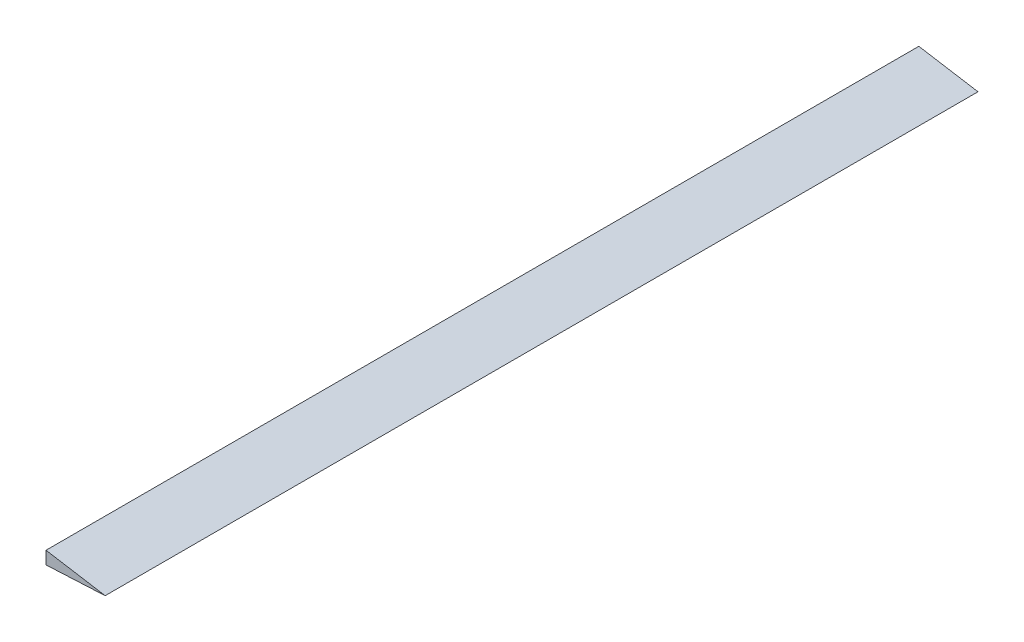
ISO-10303-21;
HEADER;
FILE_DESCRIPTION(('STEP AP214'),'2;1');
FILE_NAME('part.step','',(''),(''),'','','');
FILE_SCHEMA(('AUTOMOTIVE_DESIGN { 1 0 10303 214 1 1 1 1 }'));
ENDSEC;
DATA;
#1=APPLICATION_CONTEXT('core data for automotive mechanical design processes');
#2=APPLICATION_PROTOCOL_DEFINITION('international standard','automotive_design',2000,#1);
#3=PRODUCT_CONTEXT('',#1,'mechanical');
#4=PRODUCT('Part','Part','',(#3));
#5=PRODUCT_RELATED_PRODUCT_CATEGORY('part','',(#4));
#6=PRODUCT_DEFINITION_FORMATION('','',#4);
#7=PRODUCT_DEFINITION_CONTEXT('part definition',#1,'design');
#8=PRODUCT_DEFINITION('design','',#6,#7);
#9=PRODUCT_DEFINITION_SHAPE('','',#8);
#10=(LENGTH_UNIT() NAMED_UNIT(*) SI_UNIT(.MILLI.,.METRE.));
#11=(NAMED_UNIT(*) PLANE_ANGLE_UNIT() SI_UNIT($,.RADIAN.));
#12=(NAMED_UNIT(*) SI_UNIT($,.STERADIAN.) SOLID_ANGLE_UNIT());
#13=UNCERTAINTY_MEASURE_WITH_UNIT(LENGTH_MEASURE(1.E-05),#10,'distance_accuracy_value','');
#14=(GEOMETRIC_REPRESENTATION_CONTEXT(3) GLOBAL_UNCERTAINTY_ASSIGNED_CONTEXT((#13)) GLOBAL_UNIT_ASSIGNED_CONTEXT((#10,
#11,#12)) REPRESENTATION_CONTEXT('',''));
#15=CARTESIAN_POINT('',(0.,0.,0.));
#16=DIRECTION('',(0.,0.,1.));
#17=DIRECTION('',(1.,0.,0.));
#18=AXIS2_PLACEMENT_3D('',#15,#16,#17);
#19=CARTESIAN_POINT('',(274.102693551203,-2.52577255380021,39.261541819769));
#20=DIRECTION('',(0.0496585902517502,-0.998766251138978,0.));
#21=DIRECTION('',(0.998766251138979,0.0496585902517502,0.));
#22=AXIS2_PLACEMENT_3D('',#19,#20,#21);
#23=PLANE('',#22);
#24=DIRECTION('',(0.998766251138978,0.0496585902517502,0.));
#25=VECTOR('',#24,1.);
#26=CARTESIAN_POINT('',(274.102693551203,-2.52577255380021,-12.6999999999999));
#27=LINE('',#26,#25);
#28=CARTESIAN_POINT('',(274.102693551203,-2.52577255380021,-12.6999999999999));
#29=VERTEX_POINT('',#28);
#30=CARTESIAN_POINT('',(324.9026935512,0.,-12.6999999999999));
#31=VERTEX_POINT('',#30);
#32=EDGE_CURVE('E40',#29,#31,#27,.T.);
#33=ORIENTED_EDGE('',*,*,#32,.F.);
#34=DIRECTION('',(0.,0.,-1.));
#35=VECTOR('',#34,1.);
#36=CARTESIAN_POINT('',(274.102693551203,-2.52577255380021,39.261541819769));
#37=LINE('',#36,#35);
#38=CARTESIAN_POINT('',(274.102693551203,-2.52577255380021,-761.999746));
#39=VERTEX_POINT('',#38);
#40=EDGE_CURVE('E62',#29,#39,#37,.T.);
#41=ORIENTED_EDGE('',*,*,#40,.T.);
#42=DIRECTION('',(-0.998766251138978,-0.0496585902517502,0.));
#43=VECTOR('',#42,1.);
#44=CARTESIAN_POINT('',(274.102693551203,-2.52577255380021,-761.999746));
#45=LINE('',#44,#43);
#46=CARTESIAN_POINT('',(324.9026935512,0.,-761.999746));
#47=VERTEX_POINT('',#46);
#48=EDGE_CURVE('E66',#47,#39,#45,.T.);
#49=ORIENTED_EDGE('',*,*,#48,.F.);
#50=DIRECTION('',(0.,0.,-1.));
#51=VECTOR('',#50,1.);
#52=CARTESIAN_POINT('',(324.9026935512,0.,39.261541819769));
#53=LINE('',#52,#51);
#54=EDGE_CURVE('E84',#31,#47,#53,.T.);
#55=ORIENTED_EDGE('',*,*,#54,.F.);
#56=EDGE_LOOP('',(#33,#41,#49,#55));
#57=FACE_BOUND('',#56,.T.);
#58=ADVANCED_FACE('F33',(#57),#23,.T.);
#59=CARTESIAN_POINT('',(274.1026935512,8.39951134583515,39.261541819769));
#60=DIRECTION('',(0.163129854151705,0.986604607066298,0.));
#61=DIRECTION('',(-0.986604607066298,0.163129854151705,0.));
#62=AXIS2_PLACEMENT_3D('',#59,#60,#61);
#63=PLANE('',#62);
#64=DIRECTION('',(-0.986604607066298,0.163129854151705,0.));
#65=VECTOR('',#64,1.);
#66=CARTESIAN_POINT('',(274.1026935512,8.39951134583515,-12.6999999999999));
#67=LINE('',#66,#65);
#68=CARTESIAN_POINT('',(274.1026935512,8.39951134583515,-12.6999999999999));
#69=VERTEX_POINT('',#68);
#70=EDGE_CURVE('E86',#31,#69,#67,.T.);
#71=ORIENTED_EDGE('',*,*,#70,.F.);
#72=ORIENTED_EDGE('',*,*,#54,.T.);
#73=DIRECTION('',(0.986604607066297,-0.163129854151705,0.));
#74=VECTOR('',#73,1.);
#75=CARTESIAN_POINT('',(274.1026935512,8.39951134583515,-761.999746));
#76=LINE('',#75,#74);
#77=CARTESIAN_POINT('',(274.1026935512,8.39951134583515,-761.999746));
#78=VERTEX_POINT('',#77);
#79=EDGE_CURVE('E70',#78,#47,#76,.T.);
#80=ORIENTED_EDGE('',*,*,#79,.F.);
#81=DIRECTION('',(0.,0.,-1.));
#82=VECTOR('',#81,1.);
#83=CARTESIAN_POINT('',(274.1026935512,8.39951134583515,39.261541819769));
#84=LINE('',#83,#82);
#85=EDGE_CURVE('E69',#69,#78,#84,.T.);
#86=ORIENTED_EDGE('',*,*,#85,.F.);
#87=EDGE_LOOP('',(#71,#72,#80,#86));
#88=FACE_BOUND('',#87,.T.);
#89=ADVANCED_FACE('F89',(#88),#63,.T.);
#90=CARTESIAN_POINT('',(274.102693551203,-2.52577255380021,39.261541819769));
#91=DIRECTION('',(-1.,-2.64210970675256E-13,0.));
#92=DIRECTION('',(2.64210970675256E-13,-1.,0.));
#93=AXIS2_PLACEMENT_3D('',#90,#91,#92);
#94=PLANE('',#93);
#95=DIRECTION('',(2.64210970675256E-13,-1.,0.));
#96=VECTOR('',#95,1.);
#97=CARTESIAN_POINT('',(274.102693551203,-2.52577255380021,-12.6999999999999));
#98=LINE('',#97,#96);
#99=EDGE_CURVE('E11',#69,#29,#98,.T.);
#100=ORIENTED_EDGE('',*,*,#99,.F.);
#101=ORIENTED_EDGE('',*,*,#85,.T.);
#102=DIRECTION('',(-2.64210970675256E-13,1.,0.));
#103=VECTOR('',#102,1.);
#104=CARTESIAN_POINT('',(274.102693551203,-2.52577255380021,-761.999746));
#105=LINE('',#104,#103);
#106=EDGE_CURVE('E72',#39,#78,#105,.T.);
#107=ORIENTED_EDGE('',*,*,#106,.F.);
#108=ORIENTED_EDGE('',*,*,#40,.F.);
#109=EDGE_LOOP('',(#100,#101,#107,#108));
#110=FACE_BOUND('',#109,.T.);
#111=ADVANCED_FACE('F73',(#110),#94,.T.);
#112=CARTESIAN_POINT('',(0.,0.,-761.999746));
#113=DIRECTION('',(0.,0.,1.));
#114=DIRECTION('',(1.,0.,0.));
#115=AXIS2_PLACEMENT_3D('',#112,#113,#114);
#116=PLANE('',#115);
#117=ORIENTED_EDGE('',*,*,#48,.T.);
#118=ORIENTED_EDGE('',*,*,#106,.T.);
#119=ORIENTED_EDGE('',*,*,#79,.T.);
#120=EDGE_LOOP('',(#117,#118,#119));
#121=FACE_BOUND('',#120,.T.);
#122=ADVANCED_FACE('F78',(#121),#116,.F.);
#123=CARTESIAN_POINT('',(1.1516545592317,2.60088125935345,-12.6999999999999));
#124=DIRECTION('',(0.,0.,-1.));
#125=DIRECTION('',(-1.,0.,0.));
#126=AXIS2_PLACEMENT_3D('',#123,#124,#125);
#127=PLANE('',#126);
#128=ORIENTED_EDGE('',*,*,#32,.T.);
#129=ORIENTED_EDGE('',*,*,#70,.T.);
#130=ORIENTED_EDGE('',*,*,#99,.T.);
#131=EDGE_LOOP('',(#128,#129,#130));
#132=FACE_BOUND('',#131,.T.);
#133=ADVANCED_FACE('F88',(#132),#127,.F.);
#134=CLOSED_SHELL('',(#58,#89,#111,#122,#133));
#135=MANIFOLD_SOLID_BREP('B2',#134);
#136=ADVANCED_BREP_SHAPE_REPRESENTATION('',(#18,#135),#14);
#137=SHAPE_DEFINITION_REPRESENTATION(#9,#136);
ENDSEC;
END-ISO-10303-21;
